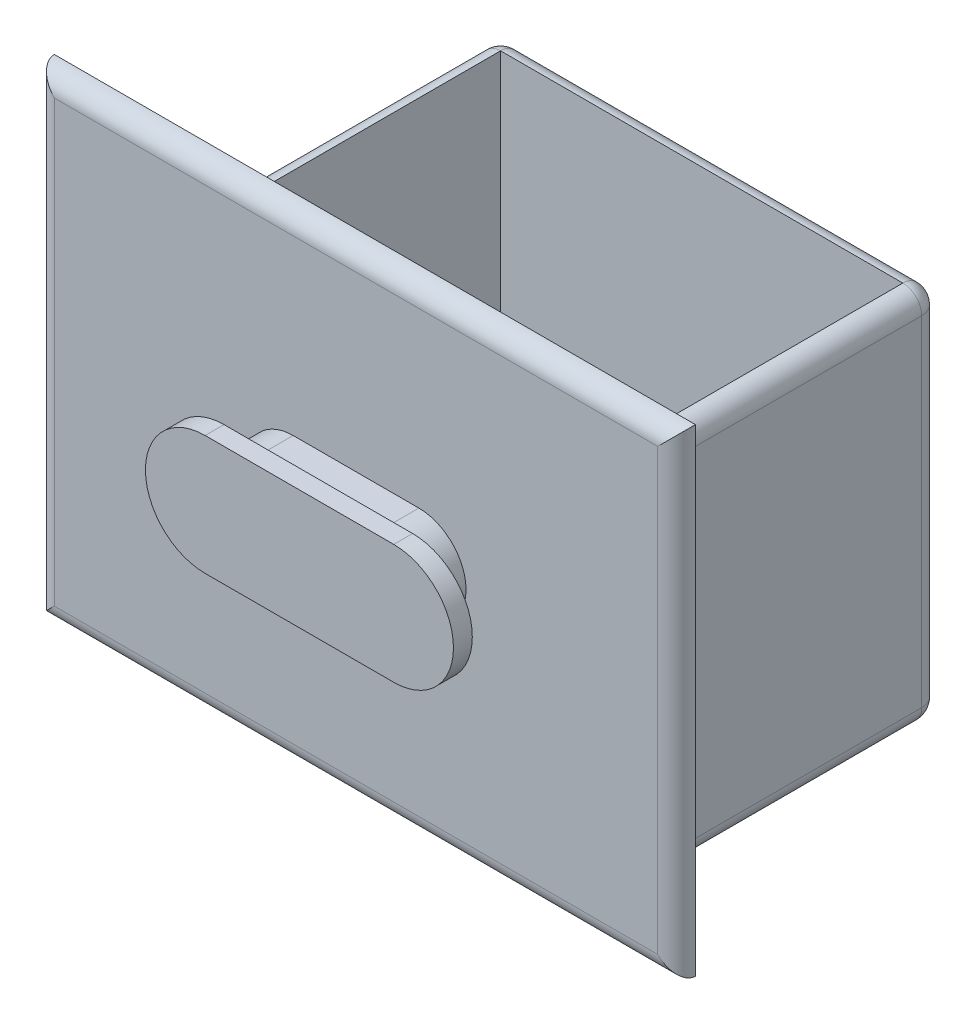
ISO-10303-21;
HEADER;
FILE_DESCRIPTION(('STEP AP214'),'2;1');
FILE_NAME('part.step','',(''),(''),'','','');
FILE_SCHEMA(('AUTOMOTIVE_DESIGN { 1 0 10303 214 1 1 1 1 }'));
ENDSEC;
DATA;
#1=APPLICATION_CONTEXT('core data for automotive mechanical design processes');
#2=APPLICATION_PROTOCOL_DEFINITION('international standard','automotive_design',2000,#1);
#3=PRODUCT_CONTEXT('',#1,'mechanical');
#4=PRODUCT('Part','Part','',(#3));
#5=PRODUCT_RELATED_PRODUCT_CATEGORY('part','',(#4));
#6=PRODUCT_DEFINITION_FORMATION('','',#4);
#7=PRODUCT_DEFINITION_CONTEXT('part definition',#1,'design');
#8=PRODUCT_DEFINITION('design','',#6,#7);
#9=PRODUCT_DEFINITION_SHAPE('','',#8);
#10=(LENGTH_UNIT() NAMED_UNIT(*) SI_UNIT(.MILLI.,.METRE.));
#11=(NAMED_UNIT(*) PLANE_ANGLE_UNIT() SI_UNIT($,.RADIAN.));
#12=(NAMED_UNIT(*) SI_UNIT($,.STERADIAN.) SOLID_ANGLE_UNIT());
#13=UNCERTAINTY_MEASURE_WITH_UNIT(LENGTH_MEASURE(1.E-05),#10,'distance_accuracy_value','');
#14=(GEOMETRIC_REPRESENTATION_CONTEXT(3) GLOBAL_UNCERTAINTY_ASSIGNED_CONTEXT((#13)) GLOBAL_UNIT_ASSIGNED_CONTEXT((#10,
#11,#12)) REPRESENTATION_CONTEXT('',''));
#15=CARTESIAN_POINT('',(0.,0.,0.));
#16=DIRECTION('',(0.,0.,1.));
#17=DIRECTION('',(1.,0.,0.));
#18=AXIS2_PLACEMENT_3D('',#15,#16,#17);
#19=CARTESIAN_POINT('',(0.,0.,58.));
#20=DIRECTION('',(0.,0.,-1.));
#21=DIRECTION('',(-1.,0.,0.));
#22=AXIS2_PLACEMENT_3D('',#19,#20,#21);
#23=PLANE('',#22);
#24=DIRECTION('',(0.,1.,0.));
#25=VECTOR('',#24,1.);
#26=CARTESIAN_POINT('',(48.,0.,58.));
#27=LINE('',#26,#25);
#28=CARTESIAN_POINT('',(48.,-27.,58.));
#29=VERTEX_POINT('',#28);
#30=CARTESIAN_POINT('',(48.,43.,58.));
#31=VERTEX_POINT('',#30);
#32=EDGE_CURVE('E323',#29,#31,#27,.T.);
#33=ORIENTED_EDGE('',*,*,#32,.T.);
#34=DIRECTION('',(-1.,0.,0.));
#35=VECTOR('',#34,1.);
#36=CARTESIAN_POINT('',(0.,43.,58.));
#37=LINE('',#36,#35);
#38=CARTESIAN_POINT('',(-48.,43.,58.));
#39=VERTEX_POINT('',#38);
#40=EDGE_CURVE('E325',#31,#39,#37,.T.);
#41=ORIENTED_EDGE('',*,*,#40,.T.);
#42=DIRECTION('',(0.,-1.,0.));
#43=VECTOR('',#42,1.);
#44=CARTESIAN_POINT('',(-48.,0.,58.));
#45=LINE('',#44,#43);
#46=CARTESIAN_POINT('',(-48.,-27.,58.));
#47=VERTEX_POINT('',#46);
#48=EDGE_CURVE('E319',#39,#47,#45,.T.);
#49=ORIENTED_EDGE('',*,*,#48,.T.);
#50=DIRECTION('',(1.,0.,0.));
#51=VECTOR('',#50,1.);
#52=CARTESIAN_POINT('',(0.,-27.,58.));
#53=LINE('',#52,#51);
#54=EDGE_CURVE('E321',#47,#29,#53,.T.);
#55=ORIENTED_EDGE('',*,*,#54,.T.);
#56=EDGE_LOOP('',(#33,#41,#49,#55));
#57=FACE_BOUND('',#56,.T.);
#58=CARTESIAN_POINT('',(-10.,7.99999999999998,58.));
#59=DIRECTION('',(0.,0.,1.));
#60=DIRECTION('',(1.,0.,0.));
#61=AXIS2_PLACEMENT_3D('',#58,#59,#60);
#62=CIRCLE('',#61,7.5);
#63=CARTESIAN_POINT('',(-10.,15.5,58.));
#64=VERTEX_POINT('',#63);
#65=CARTESIAN_POINT('',(-10.,0.499999999999985,58.));
#66=VERTEX_POINT('',#65);
#67=EDGE_CURVE('E230',#64,#66,#62,.T.);
#68=ORIENTED_EDGE('',*,*,#67,.F.);
#69=DIRECTION('',(-1.,0.,0.));
#70=VECTOR('',#69,1.);
#71=CARTESIAN_POINT('',(-10.,15.5,58.));
#72=LINE('',#71,#70);
#73=CARTESIAN_POINT('',(9.99999999999997,15.5,58.));
#74=VERTEX_POINT('',#73);
#75=EDGE_CURVE('E242',#74,#64,#72,.T.);
#76=ORIENTED_EDGE('',*,*,#75,.F.);
#77=CARTESIAN_POINT('',(9.99999999999998,7.99999999999999,58.));
#78=DIRECTION('',(0.,0.,1.));
#79=DIRECTION('',(1.,0.,0.));
#80=AXIS2_PLACEMENT_3D('',#77,#78,#79);
#81=CIRCLE('',#80,7.5);
#82=CARTESIAN_POINT('',(9.99999999999997,0.499999999999985,58.));
#83=VERTEX_POINT('',#82);
#84=EDGE_CURVE('E61',#83,#74,#81,.T.);
#85=ORIENTED_EDGE('',*,*,#84,.F.);
#86=DIRECTION('',(1.,0.,0.));
#87=VECTOR('',#86,1.);
#88=CARTESIAN_POINT('',(-10.,0.499999999999985,58.));
#89=LINE('',#88,#87);
#90=EDGE_CURVE('E56',#66,#83,#89,.T.);
#91=ORIENTED_EDGE('',*,*,#90,.F.);
#92=EDGE_LOOP('',(#68,#76,#85,#91));
#93=FACE_BOUND('',#92,.T.);
#94=ADVANCED_FACE('F39',(#57,#93),#23,.F.);
#95=CARTESIAN_POINT('',(-35.,30.,55.));
#96=DIRECTION('',(0.,-1.,0.));
#97=DIRECTION('',(0.,0.,-1.));
#98=AXIS2_PLACEMENT_3D('',#95,#96,#97);
#99=PLANE('',#98);
#100=DIRECTION('',(-1.,0.,0.));
#101=VECTOR('',#100,1.);
#102=CARTESIAN_POINT('',(0.,30.,52.));
#103=LINE('',#102,#101);
#104=CARTESIAN_POINT('',(32.,30.,52.));
#105=VERTEX_POINT('',#104);
#106=CARTESIAN_POINT('',(-32.,30.,52.));
#107=VERTEX_POINT('',#106);
#108=EDGE_CURVE('E287',#105,#107,#103,.T.);
#109=ORIENTED_EDGE('',*,*,#108,.T.);
#110=DIRECTION('',(0.,0.,-1.));
#111=VECTOR('',#110,1.);
#112=CARTESIAN_POINT('',(-32.,30.,55.));
#113=LINE('',#112,#111);
#114=CARTESIAN_POINT('',(-32.,30.,55.));
#115=VERTEX_POINT('',#114);
#116=EDGE_CURVE('E362',#107,#115,#113,.F.);
#117=ORIENTED_EDGE('',*,*,#116,.T.);
#118=DIRECTION('',(-1.,0.,0.));
#119=VECTOR('',#118,1.);
#120=CARTESIAN_POINT('',(-35.,30.,55.));
#121=LINE('',#120,#119);
#122=CARTESIAN_POINT('',(32.,30.,55.));
#123=VERTEX_POINT('',#122);
#124=EDGE_CURVE('E313',#123,#115,#121,.T.);
#125=ORIENTED_EDGE('',*,*,#124,.F.);
#126=DIRECTION('',(0.,0.,-1.));
#127=VECTOR('',#126,1.);
#128=CARTESIAN_POINT('',(32.,30.,55.));
#129=LINE('',#128,#127);
#130=EDGE_CURVE('E360',#123,#105,#129,.T.);
#131=ORIENTED_EDGE('',*,*,#130,.T.);
#132=EDGE_LOOP('',(#109,#117,#125,#131));
#133=FACE_BOUND('',#132,.T.);
#134=ADVANCED_FACE('F433',(#133),#99,.F.);
#135=CARTESIAN_POINT('',(35.,-30.,55.));
#136=DIRECTION('',(-1.,0.,0.));
#137=DIRECTION('',(0.,0.,1.));
#138=AXIS2_PLACEMENT_3D('',#135,#136,#137);
#139=PLANE('',#138);
#140=DIRECTION('',(0.,1.,0.));
#141=VECTOR('',#140,1.);
#142=CARTESIAN_POINT('',(35.,-30.,55.));
#143=LINE('',#142,#141);
#144=CARTESIAN_POINT('',(35.,-27.,55.));
#145=VERTEX_POINT('',#144);
#146=CARTESIAN_POINT('',(35.,27.,55.));
#147=VERTEX_POINT('',#146);
#148=EDGE_CURVE('E305',#145,#147,#143,.T.);
#149=ORIENTED_EDGE('',*,*,#148,.F.);
#150=DIRECTION('',(0.,0.,-1.));
#151=VECTOR('',#150,1.);
#152=CARTESIAN_POINT('',(35.,-27.,55.));
#153=LINE('',#152,#151);
#154=CARTESIAN_POINT('',(35.,-27.,3.));
#155=VERTEX_POINT('',#154);
#156=EDGE_CURVE('E344',#145,#155,#153,.T.);
#157=ORIENTED_EDGE('',*,*,#156,.T.);
#158=DIRECTION('',(0.,1.,0.));
#159=VECTOR('',#158,1.);
#160=CARTESIAN_POINT('',(35.,30.,3.));
#161=LINE('',#160,#159);
#162=CARTESIAN_POINT('',(35.,27.,3.));
#163=VERTEX_POINT('',#162);
#164=EDGE_CURVE('E331',#155,#163,#161,.T.);
#165=ORIENTED_EDGE('',*,*,#164,.T.);
#166=DIRECTION('',(0.,0.,-1.));
#167=VECTOR('',#166,1.);
#168=CARTESIAN_POINT('',(35.,27.,55.));
#169=LINE('',#168,#167);
#170=EDGE_CURVE('E342',#163,#147,#169,.F.);
#171=ORIENTED_EDGE('',*,*,#170,.T.);
#172=EDGE_LOOP('',(#149,#157,#165,#171));
#173=FACE_BOUND('',#172,.T.);
#174=ADVANCED_FACE('F501',(#173),#139,.F.);
#175=CARTESIAN_POINT('',(-35.,-30.,55.));
#176=DIRECTION('',(1.,0.,0.));
#177=DIRECTION('',(0.,0.,-1.));
#178=AXIS2_PLACEMENT_3D('',#175,#176,#177);
#179=PLANE('',#178);
#180=DIRECTION('',(0.,-1.,0.));
#181=VECTOR('',#180,1.);
#182=CARTESIAN_POINT('',(-35.,-30.,3.));
#183=LINE('',#182,#181);
#184=CARTESIAN_POINT('',(-35.,27.,3.));
#185=VERTEX_POINT('',#184);
#186=CARTESIAN_POINT('',(-35.,-27.,3.));
#187=VERTEX_POINT('',#186);
#188=EDGE_CURVE('E354',#185,#187,#183,.T.);
#189=ORIENTED_EDGE('',*,*,#188,.T.);
#190=DIRECTION('',(0.,0.,-1.));
#191=VECTOR('',#190,1.);
#192=CARTESIAN_POINT('',(-35.,-27.,55.));
#193=LINE('',#192,#191);
#194=CARTESIAN_POINT('',(-35.,-27.,55.));
#195=VERTEX_POINT('',#194);
#196=EDGE_CURVE('E358',#187,#195,#193,.F.);
#197=ORIENTED_EDGE('',*,*,#196,.T.);
#198=DIRECTION('',(0.,-1.,0.));
#199=VECTOR('',#198,1.);
#200=CARTESIAN_POINT('',(-35.,-30.,55.));
#201=LINE('',#200,#199);
#202=CARTESIAN_POINT('',(-35.,27.,55.));
#203=VERTEX_POINT('',#202);
#204=EDGE_CURVE('E316',#203,#195,#201,.T.);
#205=ORIENTED_EDGE('',*,*,#204,.F.);
#206=DIRECTION('',(0.,0.,-1.));
#207=VECTOR('',#206,1.);
#208=CARTESIAN_POINT('',(-35.,27.,55.));
#209=LINE('',#208,#207);
#210=EDGE_CURVE('E356',#203,#185,#209,.T.);
#211=ORIENTED_EDGE('',*,*,#210,.T.);
#212=EDGE_LOOP('',(#189,#197,#205,#211));
#213=FACE_BOUND('',#212,.T.);
#214=ADVANCED_FACE('F478',(#213),#179,.F.);
#215=CARTESIAN_POINT('',(-35.,-30.,55.));
#216=DIRECTION('',(0.,1.,0.));
#217=DIRECTION('',(0.,0.,1.));
#218=AXIS2_PLACEMENT_3D('',#215,#216,#217);
#219=PLANE('',#218);
#220=DIRECTION('',(1.,0.,0.));
#221=VECTOR('',#220,1.);
#222=CARTESIAN_POINT('',(35.,-30.,3.));
#223=LINE('',#222,#221);
#224=CARTESIAN_POINT('',(-32.,-30.,3.));
#225=VERTEX_POINT('',#224);
#226=CARTESIAN_POINT('',(32.,-30.,3.));
#227=VERTEX_POINT('',#226);
#228=EDGE_CURVE('E347',#225,#227,#223,.T.);
#229=ORIENTED_EDGE('',*,*,#228,.T.);
#230=DIRECTION('',(0.,0.,-1.));
#231=VECTOR('',#230,1.);
#232=CARTESIAN_POINT('',(32.,-30.,55.));
#233=LINE('',#232,#231);
#234=CARTESIAN_POINT('',(32.,-30.,55.));
#235=VERTEX_POINT('',#234);
#236=EDGE_CURVE('E351',#227,#235,#233,.F.);
#237=ORIENTED_EDGE('',*,*,#236,.T.);
#238=DIRECTION('',(1.,0.,0.));
#239=VECTOR('',#238,1.);
#240=CARTESIAN_POINT('',(-35.,-30.,55.));
#241=LINE('',#240,#239);
#242=CARTESIAN_POINT('',(-32.,-30.,55.));
#243=VERTEX_POINT('',#242);
#244=EDGE_CURVE('E328',#235,#243,#241,.F.);
#245=ORIENTED_EDGE('',*,*,#244,.T.);
#246=DIRECTION('',(0.,0.,-1.));
#247=VECTOR('',#246,1.);
#248=CARTESIAN_POINT('',(-32.,-30.,55.));
#249=LINE('',#248,#247);
#250=EDGE_CURVE('E349',#243,#225,#249,.T.);
#251=ORIENTED_EDGE('',*,*,#250,.T.);
#252=EDGE_LOOP('',(#229,#237,#245,#251));
#253=FACE_BOUND('',#252,.T.);
#254=ADVANCED_FACE('F489',(#253),#219,.F.);
#255=CARTESIAN_POINT('',(0.,0.,0.));
#256=DIRECTION('',(0.,0.,-1.));
#257=DIRECTION('',(-1.,0.,0.));
#258=AXIS2_PLACEMENT_3D('',#255,#256,#257);
#259=PLANE('',#258);
#260=DIRECTION('',(1.,0.,0.));
#261=VECTOR('',#260,1.);
#262=CARTESIAN_POINT('',(-35.,-27.,0.));
#263=LINE('',#262,#261);
#264=CARTESIAN_POINT('',(32.,-27.,0.));
#265=VERTEX_POINT('',#264);
#266=CARTESIAN_POINT('',(-32.,-27.,0.));
#267=VERTEX_POINT('',#266);
#268=EDGE_CURVE('E364',#265,#267,#263,.F.);
#269=ORIENTED_EDGE('',*,*,#268,.T.);
#270=DIRECTION('',(0.,-1.,0.));
#271=VECTOR('',#270,1.);
#272=CARTESIAN_POINT('',(-32.,30.,0.));
#273=LINE('',#272,#271);
#274=CARTESIAN_POINT('',(-32.,27.,0.));
#275=VERTEX_POINT('',#274);
#276=EDGE_CURVE('E370',#267,#275,#273,.F.);
#277=ORIENTED_EDGE('',*,*,#276,.T.);
#278=DIRECTION('',(-1.,0.,0.));
#279=VECTOR('',#278,1.);
#280=CARTESIAN_POINT('',(35.,27.,0.));
#281=LINE('',#280,#279);
#282=CARTESIAN_POINT('',(32.,27.,0.));
#283=VERTEX_POINT('',#282);
#284=EDGE_CURVE('E368',#275,#283,#281,.F.);
#285=ORIENTED_EDGE('',*,*,#284,.T.);
#286=DIRECTION('',(0.,1.,0.));
#287=VECTOR('',#286,1.);
#288=CARTESIAN_POINT('',(32.,-30.,0.));
#289=LINE('',#288,#287);
#290=EDGE_CURVE('E366',#283,#265,#289,.F.);
#291=ORIENTED_EDGE('',*,*,#290,.T.);
#292=EDGE_LOOP('',(#269,#277,#285,#291));
#293=FACE_BOUND('',#292,.T.);
#294=ADVANCED_FACE('F462',(#293),#259,.T.);
#295=CARTESIAN_POINT('',(32.,-30.,55.));
#296=DIRECTION('',(-1.,0.,0.));
#297=DIRECTION('',(0.,0.,1.));
#298=AXIS2_PLACEMENT_3D('',#295,#296,#297);
#299=PLANE('',#298);
#300=DIRECTION('',(0.,1.,0.));
#301=VECTOR('',#300,1.);
#302=CARTESIAN_POINT('',(32.,0.,3.));
#303=LINE('',#302,#301);
#304=CARTESIAN_POINT('',(32.,-27.,3.));
#305=VERTEX_POINT('',#304);
#306=CARTESIAN_POINT('',(32.,30.,3.));
#307=VERTEX_POINT('',#306);
#308=EDGE_CURVE('E280',#305,#307,#303,.T.);
#309=ORIENTED_EDGE('',*,*,#308,.F.);
#310=DIRECTION('',(0.,0.,-1.));
#311=VECTOR('',#310,1.);
#312=CARTESIAN_POINT('',(32.,-27.,55.));
#313=LINE('',#312,#311);
#314=CARTESIAN_POINT('',(32.,-27.,52.));
#315=VERTEX_POINT('',#314);
#316=EDGE_CURVE('E289',#315,#305,#313,.T.);
#317=ORIENTED_EDGE('',*,*,#316,.F.);
#318=DIRECTION('',(0.,1.,0.));
#319=VECTOR('',#318,1.);
#320=CARTESIAN_POINT('',(32.,0.,52.));
#321=LINE('',#320,#319);
#322=EDGE_CURVE('E284',#315,#105,#321,.T.);
#323=ORIENTED_EDGE('',*,*,#322,.T.);
#324=DIRECTION('',(0.,0.,-1.));
#325=VECTOR('',#324,1.);
#326=CARTESIAN_POINT('',(32.,30.,55.));
#327=LINE('',#326,#325);
#328=EDGE_CURVE('E303',#105,#307,#327,.T.);
#329=ORIENTED_EDGE('',*,*,#328,.T.);
#330=EDGE_LOOP('',(#309,#317,#323,#329));
#331=FACE_BOUND('',#330,.T.);
#332=ADVANCED_FACE('F441',(#331),#299,.T.);
#333=CARTESIAN_POINT('',(-32.,-30.,55.));
#334=DIRECTION('',(1.,0.,0.));
#335=DIRECTION('',(0.,0.,-1.));
#336=AXIS2_PLACEMENT_3D('',#333,#334,#335);
#337=PLANE('',#336);
#338=DIRECTION('',(0.,-1.,0.));
#339=VECTOR('',#338,1.);
#340=CARTESIAN_POINT('',(-32.,0.,3.));
#341=LINE('',#340,#339);
#342=CARTESIAN_POINT('',(-32.,30.,3.));
#343=VERTEX_POINT('',#342);
#344=CARTESIAN_POINT('',(-32.,-27.,3.));
#345=VERTEX_POINT('',#344);
#346=EDGE_CURVE('E295',#343,#345,#341,.T.);
#347=ORIENTED_EDGE('',*,*,#346,.F.);
#348=DIRECTION('',(0.,0.,-1.));
#349=VECTOR('',#348,1.);
#350=CARTESIAN_POINT('',(-32.,30.,55.));
#351=LINE('',#350,#349);
#352=EDGE_CURVE('E300',#107,#343,#351,.T.);
#353=ORIENTED_EDGE('',*,*,#352,.F.);
#354=DIRECTION('',(0.,-1.,0.));
#355=VECTOR('',#354,1.);
#356=CARTESIAN_POINT('',(-32.,0.,52.));
#357=LINE('',#356,#355);
#358=CARTESIAN_POINT('',(-32.,-27.,52.));
#359=VERTEX_POINT('',#358);
#360=EDGE_CURVE('E297',#107,#359,#357,.T.);
#361=ORIENTED_EDGE('',*,*,#360,.T.);
#362=DIRECTION('',(0.,0.,-1.));
#363=VECTOR('',#362,1.);
#364=CARTESIAN_POINT('',(-32.,-27.,55.));
#365=LINE('',#364,#363);
#366=EDGE_CURVE('E292',#359,#345,#365,.T.);
#367=ORIENTED_EDGE('',*,*,#366,.T.);
#368=EDGE_LOOP('',(#347,#353,#361,#367));
#369=FACE_BOUND('',#368,.T.);
#370=ADVANCED_FACE('F424',(#369),#337,.T.);
#371=CARTESIAN_POINT('',(-35.,-27.,55.));
#372=DIRECTION('',(0.,1.,0.));
#373=DIRECTION('',(0.,0.,1.));
#374=AXIS2_PLACEMENT_3D('',#371,#372,#373);
#375=PLANE('',#374);
#376=DIRECTION('',(1.,0.,0.));
#377=VECTOR('',#376,1.);
#378=CARTESIAN_POINT('',(0.,-27.,3.));
#379=LINE('',#378,#377);
#380=EDGE_CURVE('E288',#345,#305,#379,.T.);
#381=ORIENTED_EDGE('',*,*,#380,.F.);
#382=ORIENTED_EDGE('',*,*,#366,.F.);
#383=DIRECTION('',(1.,0.,0.));
#384=VECTOR('',#383,1.);
#385=CARTESIAN_POINT('',(0.,-27.,52.));
#386=LINE('',#385,#384);
#387=EDGE_CURVE('E293',#359,#315,#386,.T.);
#388=ORIENTED_EDGE('',*,*,#387,.T.);
#389=ORIENTED_EDGE('',*,*,#316,.T.);
#390=EDGE_LOOP('',(#381,#382,#388,#389));
#391=FACE_BOUND('',#390,.T.);
#392=ADVANCED_FACE('F444',(#391),#375,.T.);
#393=CARTESIAN_POINT('',(0.,0.,52.));
#394=DIRECTION('',(0.,0.,-1.));
#395=DIRECTION('',(-1.,0.,0.));
#396=AXIS2_PLACEMENT_3D('',#393,#394,#395);
#397=PLANE('',#396);
#398=ORIENTED_EDGE('',*,*,#322,.F.);
#399=ORIENTED_EDGE('',*,*,#387,.F.);
#400=ORIENTED_EDGE('',*,*,#360,.F.);
#401=ORIENTED_EDGE('',*,*,#108,.F.);
#402=EDGE_LOOP('',(#398,#399,#400,#401));
#403=FACE_BOUND('',#402,.T.);
#404=ADVANCED_FACE('F430',(#403),#397,.T.);
#405=CARTESIAN_POINT('',(0.,0.,3.));
#406=DIRECTION('',(0.,0.,-1.));
#407=DIRECTION('',(-1.,0.,0.));
#408=AXIS2_PLACEMENT_3D('',#405,#406,#407);
#409=PLANE('',#408);
#410=ORIENTED_EDGE('',*,*,#308,.T.);
#411=DIRECTION('',(-1.,0.,0.));
#412=VECTOR('',#411,1.);
#413=CARTESIAN_POINT('',(0.,30.,3.));
#414=LINE('',#413,#412);
#415=EDGE_CURVE('E283',#307,#343,#414,.T.);
#416=ORIENTED_EDGE('',*,*,#415,.T.);
#417=ORIENTED_EDGE('',*,*,#346,.T.);
#418=ORIENTED_EDGE('',*,*,#380,.T.);
#419=EDGE_LOOP('',(#410,#416,#417,#418));
#420=FACE_BOUND('',#419,.T.);
#421=ADVANCED_FACE('F446',(#420),#409,.F.);
#422=CARTESIAN_POINT('',(0.,0.,55.));
#423=DIRECTION('',(0.,0.,-1.));
#424=DIRECTION('',(-1.,0.,0.));
#425=AXIS2_PLACEMENT_3D('',#422,#423,#424);
#426=PLANE('',#425);
#427=DIRECTION('',(1.,0.,0.));
#428=VECTOR('',#427,1.);
#429=CARTESIAN_POINT('',(-51.,-30.,55.));
#430=LINE('',#429,#428);
#431=CARTESIAN_POINT('',(51.,-30.,55.));
#432=VERTEX_POINT('',#431);
#433=EDGE_CURVE('E270',#235,#432,#430,.T.);
#434=ORIENTED_EDGE('',*,*,#433,.F.);
#435=CARTESIAN_POINT('',(32.,-27.,55.));
#436=DIRECTION('',(0.,0.,-1.));
#437=DIRECTION('',(-1.,0.,0.));
#438=AXIS2_PLACEMENT_3D('',#435,#436,#437);
#439=CIRCLE('',#438,3.);
#440=EDGE_CURVE('E373',#235,#145,#439,.F.);
#441=ORIENTED_EDGE('',*,*,#440,.T.);
#442=ORIENTED_EDGE('',*,*,#148,.T.);
#443=CARTESIAN_POINT('',(32.,27.,55.));
#444=DIRECTION('',(0.,0.,-1.));
#445=DIRECTION('',(-1.,0.,0.));
#446=AXIS2_PLACEMENT_3D('',#443,#444,#445);
#447=CIRCLE('',#446,3.);
#448=EDGE_CURVE('E11',#147,#123,#447,.F.);
#449=ORIENTED_EDGE('',*,*,#448,.T.);
#450=ORIENTED_EDGE('',*,*,#124,.T.);
#451=CARTESIAN_POINT('',(-32.,27.,55.));
#452=DIRECTION('',(0.,0.,-1.));
#453=DIRECTION('',(-1.,0.,0.));
#454=AXIS2_PLACEMENT_3D('',#451,#452,#453);
#455=CIRCLE('',#454,3.);
#456=EDGE_CURVE('E48',#115,#203,#455,.F.);
#457=ORIENTED_EDGE('',*,*,#456,.T.);
#458=ORIENTED_EDGE('',*,*,#204,.T.);
#459=CARTESIAN_POINT('',(-32.,-27.,55.));
#460=DIRECTION('',(0.,0.,-1.));
#461=DIRECTION('',(-1.,0.,0.));
#462=AXIS2_PLACEMENT_3D('',#459,#460,#461);
#463=CIRCLE('',#462,3.);
#464=EDGE_CURVE('E375',#195,#243,#463,.F.);
#465=ORIENTED_EDGE('',*,*,#464,.T.);
#466=CARTESIAN_POINT('',(-51.,-30.,55.));
#467=VERTEX_POINT('',#466);
#468=EDGE_CURVE('E272',#467,#243,#430,.T.);
#469=ORIENTED_EDGE('',*,*,#468,.F.);
#470=DIRECTION('',(0.,-1.,0.));
#471=VECTOR('',#470,1.);
#472=CARTESIAN_POINT('',(-51.,-30.,55.));
#473=LINE('',#472,#471);
#474=CARTESIAN_POINT('',(-51.,46.,55.));
#475=VERTEX_POINT('',#474);
#476=EDGE_CURVE('E267',#475,#467,#473,.T.);
#477=ORIENTED_EDGE('',*,*,#476,.F.);
#478=DIRECTION('',(-1.,0.,0.));
#479=VECTOR('',#478,1.);
#480=CARTESIAN_POINT('',(-51.,46.,55.));
#481=LINE('',#480,#479);
#482=CARTESIAN_POINT('',(51.,46.,55.));
#483=VERTEX_POINT('',#482);
#484=EDGE_CURVE('E277',#483,#475,#481,.T.);
#485=ORIENTED_EDGE('',*,*,#484,.F.);
#486=DIRECTION('',(0.,1.,0.));
#487=VECTOR('',#486,1.);
#488=CARTESIAN_POINT('',(51.,-30.,55.));
#489=LINE('',#488,#487);
#490=EDGE_CURVE('E274',#432,#483,#489,.T.);
#491=ORIENTED_EDGE('',*,*,#490,.F.);
#492=EDGE_LOOP('',(#434,#441,#442,#449,#450,#457,#458,#465,#469,#477,#485,#491));
#493=FACE_BOUND('',#492,.T.);
#494=ADVANCED_FACE('F485',(#493),#426,.T.);
#495=CARTESIAN_POINT('',(0.,-27.,55.));
#496=DIRECTION('',(1.,0.,0.));
#497=DIRECTION('',(0.,0.,-1.));
#498=AXIS2_PLACEMENT_3D('',#495,#496,#497);
#499=CYLINDRICAL_SURFACE('',#498,3.);
#500=ORIENTED_EDGE('',*,*,#244,.F.);
#501=ORIENTED_EDGE('',*,*,#433,.T.);
#502=CARTESIAN_POINT('',(48.,-27.,55.));
#503=DIRECTION('',(0.707106781186547,0.707106781186547,0.));
#504=DIRECTION('',(0.707106781186547,-0.707106781186547,0.));
#505=AXIS2_PLACEMENT_3D('',#502,#503,#504);
#506=ELLIPSE('',#505,4.24264068711928,3.);
#507=EDGE_CURVE('E271',#29,#432,#506,.T.);
#508=ORIENTED_EDGE('',*,*,#507,.F.);
#509=ORIENTED_EDGE('',*,*,#54,.F.);
#510=CARTESIAN_POINT('',(-48.,-27.,55.));
#511=DIRECTION('',(0.707106781186547,-0.707106781186547,0.));
#512=DIRECTION('',(-0.707106781186547,-0.707106781186547,0.));
#513=AXIS2_PLACEMENT_3D('',#510,#511,#512);
#514=ELLIPSE('',#513,4.24264068711928,3.);
#515=EDGE_CURVE('E336',#467,#47,#514,.F.);
#516=ORIENTED_EDGE('',*,*,#515,.F.);
#517=ORIENTED_EDGE('',*,*,#468,.T.);
#518=EDGE_LOOP('',(#500,#501,#508,#509,#516,#517));
#519=FACE_BOUND('',#518,.T.);
#520=ADVANCED_FACE('F493',(#519),#499,.T.);
#521=CARTESIAN_POINT('',(48.,0.,55.));
#522=DIRECTION('',(0.,1.,0.));
#523=DIRECTION('',(0.,0.,1.));
#524=AXIS2_PLACEMENT_3D('',#521,#522,#523);
#525=CYLINDRICAL_SURFACE('',#524,3.);
#526=ORIENTED_EDGE('',*,*,#507,.T.);
#527=ORIENTED_EDGE('',*,*,#490,.T.);
#528=CARTESIAN_POINT('',(48.,43.,55.));
#529=DIRECTION('',(-0.707106781186547,0.707106781186547,0.));
#530=DIRECTION('',(0.707106781186547,0.707106781186547,0.));
#531=AXIS2_PLACEMENT_3D('',#528,#529,#530);
#532=ELLIPSE('',#531,4.24264068711928,3.);
#533=EDGE_CURVE('E334',#31,#483,#532,.T.);
#534=ORIENTED_EDGE('',*,*,#533,.F.);
#535=ORIENTED_EDGE('',*,*,#32,.F.);
#536=EDGE_LOOP('',(#526,#527,#534,#535));
#537=FACE_BOUND('',#536,.T.);
#538=ADVANCED_FACE('F580',(#537),#525,.T.);
#539=CARTESIAN_POINT('',(-48.,0.,55.));
#540=DIRECTION('',(0.,-1.,0.));
#541=DIRECTION('',(0.,0.,-1.));
#542=AXIS2_PLACEMENT_3D('',#539,#540,#541);
#543=CYLINDRICAL_SURFACE('',#542,3.);
#544=ORIENTED_EDGE('',*,*,#515,.T.);
#545=ORIENTED_EDGE('',*,*,#48,.F.);
#546=CARTESIAN_POINT('',(-48.,43.,55.));
#547=DIRECTION('',(-0.707106781186547,-0.707106781186547,0.));
#548=DIRECTION('',(0.707106781186547,-0.707106781186547,0.));
#549=AXIS2_PLACEMENT_3D('',#546,#547,#548);
#550=ELLIPSE('',#549,4.24264068711928,3.);
#551=EDGE_CURVE('E332',#475,#39,#550,.F.);
#552=ORIENTED_EDGE('',*,*,#551,.F.);
#553=ORIENTED_EDGE('',*,*,#476,.T.);
#554=EDGE_LOOP('',(#544,#545,#552,#553));
#555=FACE_BOUND('',#554,.T.);
#556=ADVANCED_FACE('F799',(#555),#543,.T.);
#557=CARTESIAN_POINT('',(0.,43.,55.));
#558=DIRECTION('',(-1.,0.,0.));
#559=DIRECTION('',(0.,0.,1.));
#560=AXIS2_PLACEMENT_3D('',#557,#558,#559);
#561=CYLINDRICAL_SURFACE('',#560,3.);
#562=ORIENTED_EDGE('',*,*,#533,.T.);
#563=ORIENTED_EDGE('',*,*,#484,.T.);
#564=ORIENTED_EDGE('',*,*,#551,.T.);
#565=ORIENTED_EDGE('',*,*,#40,.F.);
#566=EDGE_LOOP('',(#562,#563,#564,#565));
#567=FACE_BOUND('',#566,.T.);
#568=ADVANCED_FACE('F589',(#567),#561,.T.);
#569=CARTESIAN_POINT('',(-32.,27.,55.));
#570=DIRECTION('',(0.,0.,-1.));
#571=DIRECTION('',(-1.,0.,0.));
#572=AXIS2_PLACEMENT_3D('',#569,#570,#571);
#573=CYLINDRICAL_SURFACE('',#572,3.);
#574=CARTESIAN_POINT('',(-32.,27.,3.));
#575=DIRECTION('',(0.,0.,-1.));
#576=DIRECTION('',(-1.,0.,0.));
#577=AXIS2_PLACEMENT_3D('',#574,#575,#576);
#578=CIRCLE('',#577,3.);
#579=EDGE_CURVE('E43',#185,#343,#578,.T.);
#580=ORIENTED_EDGE('',*,*,#579,.F.);
#581=ORIENTED_EDGE('',*,*,#210,.F.);
#582=ORIENTED_EDGE('',*,*,#456,.F.);
#583=ORIENTED_EDGE('',*,*,#116,.F.);
#584=ORIENTED_EDGE('',*,*,#352,.T.);
#585=EDGE_LOOP('',(#580,#581,#582,#583,#584));
#586=FACE_BOUND('',#585,.T.);
#587=ADVANCED_FACE('F41',(#586),#573,.T.);
#588=CARTESIAN_POINT('',(-32.,27.,3.));
#589=DIRECTION('',(0.,1.,0.));
#590=DIRECTION('',(0.,0.,1.));
#591=AXIS2_PLACEMENT_3D('',#588,#589,#590);
#592=SPHERICAL_SURFACE('',#591,3.);
#593=CARTESIAN_POINT('',(-32.,27.,3.));
#594=DIRECTION('',(0.,1.,0.));
#595=DIRECTION('',(-1.,0.,0.));
#596=AXIS2_PLACEMENT_3D('',#593,#594,#595);
#597=CIRCLE('',#596,3.);
#598=EDGE_CURVE('E404',#185,#275,#597,.F.);
#599=ORIENTED_EDGE('',*,*,#598,.F.);
#600=ORIENTED_EDGE('',*,*,#579,.T.);
#601=CARTESIAN_POINT('',(-32.,27.,3.));
#602=DIRECTION('',(-1.,0.,0.));
#603=DIRECTION('',(0.,0.,1.));
#604=AXIS2_PLACEMENT_3D('',#601,#602,#603);
#605=CIRCLE('',#604,3.);
#606=EDGE_CURVE('E406',#275,#343,#605,.F.);
#607=ORIENTED_EDGE('',*,*,#606,.F.);
#608=EDGE_LOOP('',(#599,#600,#607));
#609=FACE_BOUND('',#608,.T.);
#610=ADVANCED_FACE('F415',(#609),#592,.T.);
#611=CARTESIAN_POINT('',(32.,27.,55.));
#612=DIRECTION('',(0.,0.,-1.));
#613=DIRECTION('',(-1.,0.,0.));
#614=AXIS2_PLACEMENT_3D('',#611,#612,#613);
#615=CYLINDRICAL_SURFACE('',#614,3.);
#616=ORIENTED_EDGE('',*,*,#448,.F.);
#617=ORIENTED_EDGE('',*,*,#170,.F.);
#618=CARTESIAN_POINT('',(32.,27.,3.));
#619=DIRECTION('',(0.,0.,-1.));
#620=DIRECTION('',(-1.,0.,0.));
#621=AXIS2_PLACEMENT_3D('',#618,#619,#620);
#622=CIRCLE('',#621,3.);
#623=EDGE_CURVE('E401',#307,#163,#622,.T.);
#624=ORIENTED_EDGE('',*,*,#623,.F.);
#625=ORIENTED_EDGE('',*,*,#328,.F.);
#626=ORIENTED_EDGE('',*,*,#130,.F.);
#627=EDGE_LOOP('',(#616,#617,#624,#625,#626));
#628=FACE_BOUND('',#627,.T.);
#629=ADVANCED_FACE('F452',(#628),#615,.T.);
#630=CARTESIAN_POINT('',(-35.,27.,3.));
#631=DIRECTION('',(1.,0.,0.));
#632=DIRECTION('',(0.,0.,-1.));
#633=AXIS2_PLACEMENT_3D('',#630,#631,#632);
#634=CYLINDRICAL_SURFACE('',#633,3.);
#635=ORIENTED_EDGE('',*,*,#606,.T.);
#636=ORIENTED_EDGE('',*,*,#415,.F.);
#637=CARTESIAN_POINT('',(32.,27.,3.));
#638=DIRECTION('',(1.,0.,0.));
#639=DIRECTION('',(0.,0.,-1.));
#640=AXIS2_PLACEMENT_3D('',#637,#638,#639);
#641=CIRCLE('',#640,3.);
#642=EDGE_CURVE('E398',#283,#307,#641,.T.);
#643=ORIENTED_EDGE('',*,*,#642,.F.);
#644=ORIENTED_EDGE('',*,*,#284,.F.);
#645=EDGE_LOOP('',(#635,#636,#643,#644));
#646=FACE_BOUND('',#645,.T.);
#647=ADVANCED_FACE('F449',(#646),#634,.T.);
#648=CARTESIAN_POINT('',(-32.,-30.,3.));
#649=DIRECTION('',(0.,1.,0.));
#650=DIRECTION('',(0.,0.,1.));
#651=AXIS2_PLACEMENT_3D('',#648,#649,#650);
#652=CYLINDRICAL_SURFACE('',#651,3.);
#653=ORIENTED_EDGE('',*,*,#598,.T.);
#654=ORIENTED_EDGE('',*,*,#276,.F.);
#655=CARTESIAN_POINT('',(-32.,-27.,3.));
#656=DIRECTION('',(0.,-1.,0.));
#657=DIRECTION('',(0.,0.,-1.));
#658=AXIS2_PLACEMENT_3D('',#655,#656,#657);
#659=CIRCLE('',#658,3.);
#660=EDGE_CURVE('E395',#187,#267,#659,.T.);
#661=ORIENTED_EDGE('',*,*,#660,.F.);
#662=ORIENTED_EDGE('',*,*,#188,.F.);
#663=EDGE_LOOP('',(#653,#654,#661,#662));
#664=FACE_BOUND('',#663,.T.);
#665=ADVANCED_FACE('F475',(#664),#652,.T.);
#666=CARTESIAN_POINT('',(-32.,-27.,55.));
#667=DIRECTION('',(0.,0.,-1.));
#668=DIRECTION('',(-1.,0.,0.));
#669=AXIS2_PLACEMENT_3D('',#666,#667,#668);
#670=CYLINDRICAL_SURFACE('',#669,3.);
#671=ORIENTED_EDGE('',*,*,#464,.F.);
#672=ORIENTED_EDGE('',*,*,#196,.F.);
#673=CARTESIAN_POINT('',(-32.,-27.,3.));
#674=DIRECTION('',(0.,0.,-1.));
#675=DIRECTION('',(-1.,0.,0.));
#676=AXIS2_PLACEMENT_3D('',#673,#674,#675);
#677=CIRCLE('',#676,3.);
#678=EDGE_CURVE('E392',#225,#187,#677,.T.);
#679=ORIENTED_EDGE('',*,*,#678,.F.);
#680=ORIENTED_EDGE('',*,*,#250,.F.);
#681=EDGE_LOOP('',(#671,#672,#679,#680));
#682=FACE_BOUND('',#681,.T.);
#683=ADVANCED_FACE('F482',(#682),#670,.T.);
#684=CARTESIAN_POINT('',(32.,27.,3.));
#685=DIRECTION('',(0.,1.,0.));
#686=DIRECTION('',(0.,0.,1.));
#687=AXIS2_PLACEMENT_3D('',#684,#685,#686);
#688=SPHERICAL_SURFACE('',#687,3.);
#689=ORIENTED_EDGE('',*,*,#642,.T.);
#690=ORIENTED_EDGE('',*,*,#623,.T.);
#691=CARTESIAN_POINT('',(32.,27.,3.));
#692=DIRECTION('',(0.,1.,0.));
#693=DIRECTION('',(0.,0.,1.));
#694=AXIS2_PLACEMENT_3D('',#691,#692,#693);
#695=CIRCLE('',#694,3.);
#696=EDGE_CURVE('E389',#283,#163,#695,.F.);
#697=ORIENTED_EDGE('',*,*,#696,.F.);
#698=EDGE_LOOP('',(#689,#690,#697));
#699=FACE_BOUND('',#698,.T.);
#700=ADVANCED_FACE('F454',(#699),#688,.T.);
#701=CARTESIAN_POINT('',(-32.,-27.,3.));
#702=DIRECTION('',(-1.,0.,0.));
#703=DIRECTION('',(0.,0.,1.));
#704=AXIS2_PLACEMENT_3D('',#701,#702,#703);
#705=SPHERICAL_SURFACE('',#704,3.);
#706=ORIENTED_EDGE('',*,*,#678,.T.);
#707=ORIENTED_EDGE('',*,*,#660,.T.);
#708=CARTESIAN_POINT('',(-32.,-27.,3.));
#709=DIRECTION('',(-1.,0.,0.));
#710=DIRECTION('',(0.,0.,1.));
#711=AXIS2_PLACEMENT_3D('',#708,#709,#710);
#712=CIRCLE('',#711,3.);
#713=EDGE_CURVE('E386',#225,#267,#712,.F.);
#714=ORIENTED_EDGE('',*,*,#713,.F.);
#715=EDGE_LOOP('',(#706,#707,#714));
#716=FACE_BOUND('',#715,.T.);
#717=ADVANCED_FACE('F471',(#716),#705,.T.);
#718=CARTESIAN_POINT('',(32.,-30.,3.));
#719=DIRECTION('',(0.,-1.,0.));
#720=DIRECTION('',(0.,0.,-1.));
#721=AXIS2_PLACEMENT_3D('',#718,#719,#720);
#722=CYLINDRICAL_SURFACE('',#721,3.);
#723=ORIENTED_EDGE('',*,*,#696,.T.);
#724=ORIENTED_EDGE('',*,*,#164,.F.);
#725=CARTESIAN_POINT('',(32.,-27.,3.));
#726=DIRECTION('',(0.,-1.,0.));
#727=DIRECTION('',(0.,0.,-1.));
#728=AXIS2_PLACEMENT_3D('',#725,#726,#727);
#729=CIRCLE('',#728,3.);
#730=EDGE_CURVE('E383',#265,#155,#729,.T.);
#731=ORIENTED_EDGE('',*,*,#730,.F.);
#732=ORIENTED_EDGE('',*,*,#290,.F.);
#733=EDGE_LOOP('',(#723,#724,#731,#732));
#734=FACE_BOUND('',#733,.T.);
#735=ADVANCED_FACE('F459',(#734),#722,.T.);
#736=CARTESIAN_POINT('',(-35.,-27.,3.));
#737=DIRECTION('',(-1.,0.,0.));
#738=DIRECTION('',(0.,0.,1.));
#739=AXIS2_PLACEMENT_3D('',#736,#737,#738);
#740=CYLINDRICAL_SURFACE('',#739,3.);
#741=ORIENTED_EDGE('',*,*,#713,.T.);
#742=ORIENTED_EDGE('',*,*,#268,.F.);
#743=CARTESIAN_POINT('',(32.,-27.,3.));
#744=DIRECTION('',(1.,0.,0.));
#745=DIRECTION('',(0.,0.,-1.));
#746=AXIS2_PLACEMENT_3D('',#743,#744,#745);
#747=CIRCLE('',#746,3.);
#748=EDGE_CURVE('E380',#227,#265,#747,.T.);
#749=ORIENTED_EDGE('',*,*,#748,.F.);
#750=ORIENTED_EDGE('',*,*,#228,.F.);
#751=EDGE_LOOP('',(#741,#742,#749,#750));
#752=FACE_BOUND('',#751,.T.);
#753=ADVANCED_FACE('F466',(#752),#740,.T.);
#754=CARTESIAN_POINT('',(32.,-27.,3.));
#755=DIRECTION('',(0.,0.,-1.));
#756=DIRECTION('',(-1.,0.,0.));
#757=AXIS2_PLACEMENT_3D('',#754,#755,#756);
#758=SPHERICAL_SURFACE('',#757,3.);
#759=ORIENTED_EDGE('',*,*,#748,.T.);
#760=ORIENTED_EDGE('',*,*,#730,.T.);
#761=CARTESIAN_POINT('',(32.,-27.,3.));
#762=DIRECTION('',(0.,0.,-1.));
#763=DIRECTION('',(-1.,0.,0.));
#764=AXIS2_PLACEMENT_3D('',#761,#762,#763);
#765=CIRCLE('',#764,3.);
#766=EDGE_CURVE('E266',#227,#155,#765,.F.);
#767=ORIENTED_EDGE('',*,*,#766,.F.);
#768=EDGE_LOOP('',(#759,#760,#767));
#769=FACE_BOUND('',#768,.T.);
#770=ADVANCED_FACE('F652',(#769),#758,.T.);
#771=CARTESIAN_POINT('',(32.,-27.,55.));
#772=DIRECTION('',(0.,0.,-1.));
#773=DIRECTION('',(-1.,0.,0.));
#774=AXIS2_PLACEMENT_3D('',#771,#772,#773);
#775=CYLINDRICAL_SURFACE('',#774,3.);
#776=ORIENTED_EDGE('',*,*,#440,.F.);
#777=ORIENTED_EDGE('',*,*,#236,.F.);
#778=ORIENTED_EDGE('',*,*,#766,.T.);
#779=ORIENTED_EDGE('',*,*,#156,.F.);
#780=EDGE_LOOP('',(#776,#777,#778,#779));
#781=FACE_BOUND('',#780,.T.);
#782=ADVANCED_FACE('F497',(#781),#775,.T.);
#783=CARTESIAN_POINT('',(-10.,7.99999999999998,64.));
#784=DIRECTION('',(0.,0.,-1.));
#785=DIRECTION('',(-1.,0.,0.));
#786=AXIS2_PLACEMENT_3D('',#783,#784,#785);
#787=CYLINDRICAL_SURFACE('',#786,7.5);
#788=ORIENTED_EDGE('',*,*,#67,.T.);
#789=DIRECTION('',(0.,0.,-1.));
#790=VECTOR('',#789,1.);
#791=CARTESIAN_POINT('',(-10.,0.499999999999985,64.));
#792=LINE('',#791,#790);
#793=CARTESIAN_POINT('',(-10.,0.499999999999985,64.));
#794=VERTEX_POINT('',#793);
#795=EDGE_CURVE('E264',#794,#66,#792,.T.);
#796=ORIENTED_EDGE('',*,*,#795,.F.);
#797=CARTESIAN_POINT('',(-10.,7.99999999999998,64.));
#798=DIRECTION('',(0.,0.,1.));
#799=DIRECTION('',(1.,0.,0.));
#800=AXIS2_PLACEMENT_3D('',#797,#798,#799);
#801=CIRCLE('',#800,7.5);
#802=CARTESIAN_POINT('',(-10.,15.5,64.));
#803=VERTEX_POINT('',#802);
#804=EDGE_CURVE('E238',#803,#794,#801,.T.);
#805=ORIENTED_EDGE('',*,*,#804,.F.);
#806=DIRECTION('',(0.,0.,-1.));
#807=VECTOR('',#806,1.);
#808=CARTESIAN_POINT('',(-10.,15.5,64.));
#809=LINE('',#808,#807);
#810=EDGE_CURVE('E250',#803,#64,#809,.T.);
#811=ORIENTED_EDGE('',*,*,#810,.T.);
#812=EDGE_LOOP('',(#788,#796,#805,#811));
#813=FACE_BOUND('',#812,.T.);
#814=ADVANCED_FACE('F520',(#813),#787,.T.);
#815=CARTESIAN_POINT('',(-10.,0.499999999999985,64.));
#816=DIRECTION('',(0.,1.,0.));
#817=DIRECTION('',(-1.,0.,0.));
#818=AXIS2_PLACEMENT_3D('',#815,#816,#817);
#819=PLANE('',#818);
#820=ORIENTED_EDGE('',*,*,#90,.T.);
#821=DIRECTION('',(0.,0.,-1.));
#822=VECTOR('',#821,1.);
#823=CARTESIAN_POINT('',(9.99999999999997,0.499999999999985,64.));
#824=LINE('',#823,#822);
#825=CARTESIAN_POINT('',(9.99999999999997,0.499999999999985,64.));
#826=VERTEX_POINT('',#825);
#827=EDGE_CURVE('E261',#826,#83,#824,.T.);
#828=ORIENTED_EDGE('',*,*,#827,.F.);
#829=DIRECTION('',(1.,0.,0.));
#830=VECTOR('',#829,1.);
#831=CARTESIAN_POINT('',(-10.,0.499999999999985,64.));
#832=LINE('',#831,#830);
#833=EDGE_CURVE('E241',#794,#826,#832,.T.);
#834=ORIENTED_EDGE('',*,*,#833,.F.);
#835=ORIENTED_EDGE('',*,*,#795,.T.);
#836=EDGE_LOOP('',(#820,#828,#834,#835));
#837=FACE_BOUND('',#836,.T.);
#838=ADVANCED_FACE('F680',(#837),#819,.F.);
#839=CARTESIAN_POINT('',(9.99999999999998,7.99999999999999,64.));
#840=DIRECTION('',(0.,0.,-1.));
#841=DIRECTION('',(-1.,0.,0.));
#842=AXIS2_PLACEMENT_3D('',#839,#840,#841);
#843=CYLINDRICAL_SURFACE('',#842,7.5);
#844=ORIENTED_EDGE('',*,*,#84,.T.);
#845=DIRECTION('',(0.,0.,-1.));
#846=VECTOR('',#845,1.);
#847=CARTESIAN_POINT('',(9.99999999999997,15.5,64.));
#848=LINE('',#847,#846);
#849=CARTESIAN_POINT('',(9.99999999999997,15.5,64.));
#850=VERTEX_POINT('',#849);
#851=EDGE_CURVE('E258',#850,#74,#848,.T.);
#852=ORIENTED_EDGE('',*,*,#851,.F.);
#853=CARTESIAN_POINT('',(9.99999999999998,7.99999999999999,64.));
#854=DIRECTION('',(0.,0.,1.));
#855=DIRECTION('',(1.,0.,0.));
#856=AXIS2_PLACEMENT_3D('',#853,#854,#855);
#857=CIRCLE('',#856,7.5);
#858=EDGE_CURVE('E245',#826,#850,#857,.T.);
#859=ORIENTED_EDGE('',*,*,#858,.F.);
#860=ORIENTED_EDGE('',*,*,#827,.T.);
#861=EDGE_LOOP('',(#844,#852,#859,#860));
#862=FACE_BOUND('',#861,.T.);
#863=ADVANCED_FACE('F689',(#862),#843,.T.);
#864=CARTESIAN_POINT('',(-10.,15.5,64.));
#865=DIRECTION('',(0.,-1.,0.));
#866=DIRECTION('',(1.,0.,0.));
#867=AXIS2_PLACEMENT_3D('',#864,#865,#866);
#868=PLANE('',#867);
#869=ORIENTED_EDGE('',*,*,#75,.T.);
#870=ORIENTED_EDGE('',*,*,#810,.F.);
#871=DIRECTION('',(-1.,0.,0.));
#872=VECTOR('',#871,1.);
#873=CARTESIAN_POINT('',(-10.,15.5,64.));
#874=LINE('',#873,#872);
#875=EDGE_CURVE('E248',#850,#803,#874,.T.);
#876=ORIENTED_EDGE('',*,*,#875,.F.);
#877=ORIENTED_EDGE('',*,*,#851,.T.);
#878=EDGE_LOOP('',(#869,#870,#876,#877));
#879=FACE_BOUND('',#878,.T.);
#880=ADVANCED_FACE('F698',(#879),#868,.F.);
#881=CARTESIAN_POINT('',(-15.,7.99999999999998,64.));
#882=DIRECTION('',(0.,0.,1.));
#883=DIRECTION('',(1.,0.,0.));
#884=AXIS2_PLACEMENT_3D('',#881,#882,#883);
#885=PLANE('',#884);
#886=CARTESIAN_POINT('',(-15.,7.99999999999998,64.));
#887=DIRECTION('',(0.,0.,1.));
#888=DIRECTION('',(1.,0.,0.));
#889=AXIS2_PLACEMENT_3D('',#886,#887,#888);
#890=CIRCLE('',#889,9.5);
#891=CARTESIAN_POINT('',(-15.,17.5,64.));
#892=VERTEX_POINT('',#891);
#893=CARTESIAN_POINT('',(-15.,-1.50000000000002,64.));
#894=VERTEX_POINT('',#893);
#895=EDGE_CURVE('E229',#892,#894,#890,.T.);
#896=ORIENTED_EDGE('',*,*,#895,.F.);
#897=DIRECTION('',(-1.,0.,0.));
#898=VECTOR('',#897,1.);
#899=CARTESIAN_POINT('',(-15.,17.5,64.));
#900=LINE('',#899,#898);
#901=CARTESIAN_POINT('',(15.,17.5,64.));
#902=VERTEX_POINT('',#901);
#903=EDGE_CURVE('E225',#902,#892,#900,.T.);
#904=ORIENTED_EDGE('',*,*,#903,.F.);
#905=CARTESIAN_POINT('',(15.,7.99999999999998,64.));
#906=DIRECTION('',(0.,0.,1.));
#907=DIRECTION('',(1.,0.,0.));
#908=AXIS2_PLACEMENT_3D('',#905,#906,#907);
#909=CIRCLE('',#908,9.5);
#910=CARTESIAN_POINT('',(15.,-1.50000000000001,64.));
#911=VERTEX_POINT('',#910);
#912=EDGE_CURVE('E770',#911,#902,#909,.T.);
#913=ORIENTED_EDGE('',*,*,#912,.F.);
#914=DIRECTION('',(1.,0.,0.));
#915=VECTOR('',#914,1.);
#916=CARTESIAN_POINT('',(-15.,-1.50000000000002,64.));
#917=LINE('',#916,#915);
#918=EDGE_CURVE('E774',#894,#911,#917,.T.);
#919=ORIENTED_EDGE('',*,*,#918,.F.);
#920=EDGE_LOOP('',(#896,#904,#913,#919));
#921=FACE_BOUND('',#920,.T.);
#922=ORIENTED_EDGE('',*,*,#875,.T.);
#923=ORIENTED_EDGE('',*,*,#804,.T.);
#924=ORIENTED_EDGE('',*,*,#833,.T.);
#925=ORIENTED_EDGE('',*,*,#858,.T.);
#926=EDGE_LOOP('',(#922,#923,#924,#925));
#927=FACE_BOUND('',#926,.T.);
#928=ADVANCED_FACE('F708',(#921,#927),#885,.F.);
#929=CARTESIAN_POINT('',(-15.,7.99999999999998,67.));
#930=DIRECTION('',(0.,0.,-1.));
#931=DIRECTION('',(-1.,0.,0.));
#932=AXIS2_PLACEMENT_3D('',#929,#930,#931);
#933=CYLINDRICAL_SURFACE('',#932,9.5);
#934=ORIENTED_EDGE('',*,*,#895,.T.);
#935=DIRECTION('',(0.,0.,-1.));
#936=VECTOR('',#935,1.);
#937=CARTESIAN_POINT('',(-15.,-1.50000000000002,67.));
#938=LINE('',#937,#936);
#939=CARTESIAN_POINT('',(-15.,-1.50000000000002,67.));
#940=VERTEX_POINT('',#939);
#941=EDGE_CURVE('E209',#940,#894,#938,.T.);
#942=ORIENTED_EDGE('',*,*,#941,.F.);
#943=CARTESIAN_POINT('',(-15.,7.99999999999998,67.));
#944=DIRECTION('',(0.,0.,1.));
#945=DIRECTION('',(1.,0.,0.));
#946=AXIS2_PLACEMENT_3D('',#943,#944,#945);
#947=CIRCLE('',#946,9.5);
#948=CARTESIAN_POINT('',(-15.,17.5,67.));
#949=VERTEX_POINT('',#948);
#950=EDGE_CURVE('E216',#949,#940,#947,.T.);
#951=ORIENTED_EDGE('',*,*,#950,.F.);
#952=DIRECTION('',(0.,0.,-1.));
#953=VECTOR('',#952,1.);
#954=CARTESIAN_POINT('',(-15.,17.5,67.));
#955=LINE('',#954,#953);
#956=EDGE_CURVE('E767',#949,#892,#955,.T.);
#957=ORIENTED_EDGE('',*,*,#956,.T.);
#958=EDGE_LOOP('',(#934,#942,#951,#957));
#959=FACE_BOUND('',#958,.T.);
#960=ADVANCED_FACE('F227',(#959),#933,.T.);
#961=CARTESIAN_POINT('',(-15.,-1.50000000000002,67.));
#962=DIRECTION('',(0.,1.,0.));
#963=DIRECTION('',(-1.,0.,0.));
#964=AXIS2_PLACEMENT_3D('',#961,#962,#963);
#965=PLANE('',#964);
#966=ORIENTED_EDGE('',*,*,#918,.T.);
#967=DIRECTION('',(0.,0.,-1.));
#968=VECTOR('',#967,1.);
#969=CARTESIAN_POINT('',(15.,-1.50000000000001,67.));
#970=LINE('',#969,#968);
#971=CARTESIAN_POINT('',(15.,-1.50000000000001,67.));
#972=VERTEX_POINT('',#971);
#973=EDGE_CURVE('E212',#972,#911,#970,.T.);
#974=ORIENTED_EDGE('',*,*,#973,.F.);
#975=DIRECTION('',(1.,0.,0.));
#976=VECTOR('',#975,1.);
#977=CARTESIAN_POINT('',(-15.,-1.50000000000002,67.));
#978=LINE('',#977,#976);
#979=EDGE_CURVE('E205',#940,#972,#978,.T.);
#980=ORIENTED_EDGE('',*,*,#979,.F.);
#981=ORIENTED_EDGE('',*,*,#941,.T.);
#982=EDGE_LOOP('',(#966,#974,#980,#981));
#983=FACE_BOUND('',#982,.T.);
#984=ADVANCED_FACE('F207',(#983),#965,.F.);
#985=CARTESIAN_POINT('',(15.,7.99999999999998,67.));
#986=DIRECTION('',(0.,0.,-1.));
#987=DIRECTION('',(-1.,0.,0.));
#988=AXIS2_PLACEMENT_3D('',#985,#986,#987);
#989=CYLINDRICAL_SURFACE('',#988,9.5);
#990=ORIENTED_EDGE('',*,*,#912,.T.);
#991=DIRECTION('',(0.,0.,-1.));
#992=VECTOR('',#991,1.);
#993=CARTESIAN_POINT('',(15.,17.5,67.));
#994=LINE('',#993,#992);
#995=CARTESIAN_POINT('',(15.,17.5,67.));
#996=VERTEX_POINT('',#995);
#997=EDGE_CURVE('E234',#996,#902,#994,.T.);
#998=ORIENTED_EDGE('',*,*,#997,.F.);
#999=CARTESIAN_POINT('',(15.,7.99999999999998,67.));
#1000=DIRECTION('',(0.,0.,1.));
#1001=DIRECTION('',(1.,0.,0.));
#1002=AXIS2_PLACEMENT_3D('',#999,#1000,#1001);
#1003=CIRCLE('',#1002,9.5);
#1004=EDGE_CURVE('E215',#972,#996,#1003,.T.);
#1005=ORIENTED_EDGE('',*,*,#1004,.F.);
#1006=ORIENTED_EDGE('',*,*,#973,.T.);
#1007=EDGE_LOOP('',(#990,#998,#1005,#1006));
#1008=FACE_BOUND('',#1007,.T.);
#1009=ADVANCED_FACE('F735',(#1008),#989,.T.);
#1010=CARTESIAN_POINT('',(-15.,17.5,67.));
#1011=DIRECTION('',(0.,-1.,0.));
#1012=DIRECTION('',(1.,0.,0.));
#1013=AXIS2_PLACEMENT_3D('',#1010,#1011,#1012);
#1014=PLANE('',#1013);
#1015=ORIENTED_EDGE('',*,*,#903,.T.);
#1016=ORIENTED_EDGE('',*,*,#956,.F.);
#1017=DIRECTION('',(-1.,0.,0.));
#1018=VECTOR('',#1017,1.);
#1019=CARTESIAN_POINT('',(-15.,17.5,67.));
#1020=LINE('',#1019,#1018);
#1021=EDGE_CURVE('E221',#996,#949,#1020,.T.);
#1022=ORIENTED_EDGE('',*,*,#1021,.F.);
#1023=ORIENTED_EDGE('',*,*,#997,.T.);
#1024=EDGE_LOOP('',(#1015,#1016,#1022,#1023));
#1025=FACE_BOUND('',#1024,.T.);
#1026=ADVANCED_FACE('F744',(#1025),#1014,.F.);
#1027=CARTESIAN_POINT('',(-15.,7.99999999999998,67.));
#1028=DIRECTION('',(0.,0.,1.));
#1029=DIRECTION('',(1.,0.,0.));
#1030=AXIS2_PLACEMENT_3D('',#1027,#1028,#1029);
#1031=PLANE('',#1030);
#1032=ORIENTED_EDGE('',*,*,#950,.T.);
#1033=ORIENTED_EDGE('',*,*,#979,.T.);
#1034=ORIENTED_EDGE('',*,*,#1004,.T.);
#1035=ORIENTED_EDGE('',*,*,#1021,.T.);
#1036=EDGE_LOOP('',(#1032,#1033,#1034,#1035));
#1037=FACE_BOUND('',#1036,.T.);
#1038=ADVANCED_FACE('F219',(#1037),#1031,.T.);
#1039=CLOSED_SHELL('',(#94,#134,#174,#214,#254,#294,#332,#370,#392,#404,#421,#494,#520,#538,
#556,#568,#587,#610,#629,#647,#665,#683,#700,#717,#735,#753,#770,#782,#814,#838,#863,#880,#928,
#960,#984,#1009,#1026,#1038));
#1040=MANIFOLD_SOLID_BREP('B2',#1039);
#1041=ADVANCED_BREP_SHAPE_REPRESENTATION('',(#18,#1040),#14);
#1042=SHAPE_DEFINITION_REPRESENTATION(#9,#1041);
ENDSEC;
END-ISO-10303-21;
